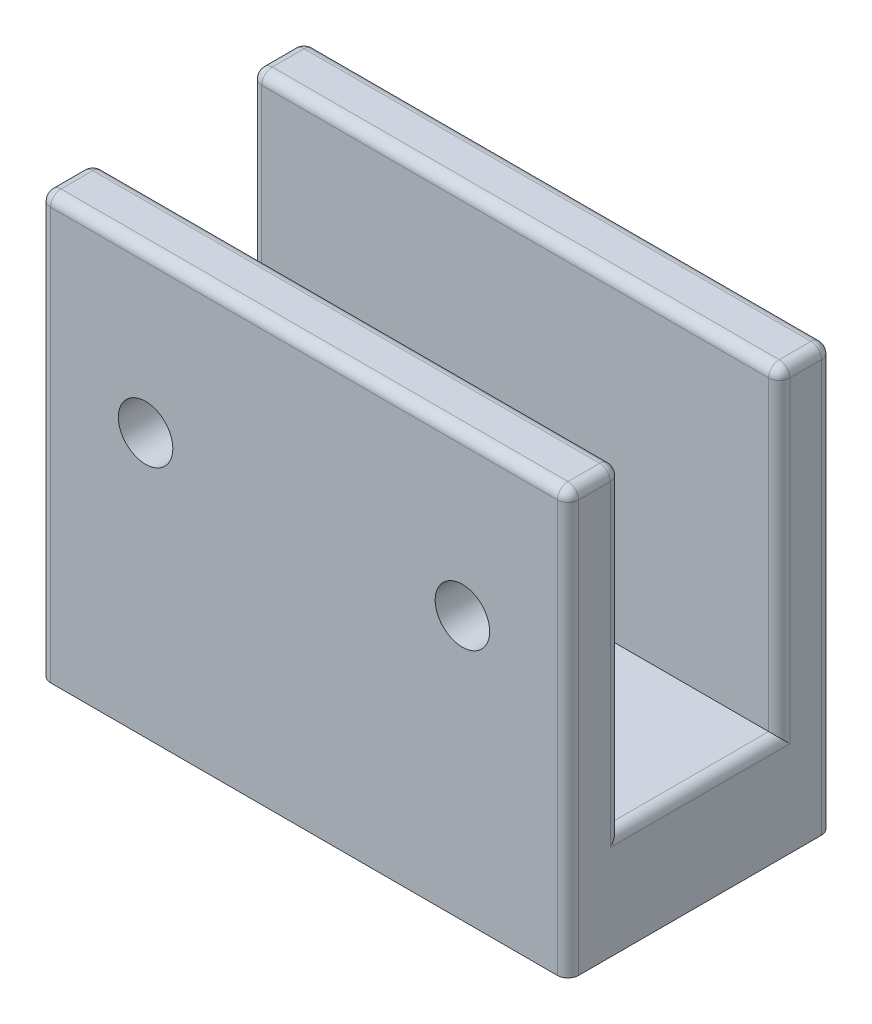
ISO-10303-21;
HEADER;
FILE_DESCRIPTION(('STEP AP214'),'2;1');
FILE_NAME('part.step','',(''),(''),'','','');
FILE_SCHEMA(('AUTOMOTIVE_DESIGN { 1 0 10303 214 1 1 1 1 }'));
ENDSEC;
DATA;
#1=APPLICATION_CONTEXT('core data for automotive mechanical design processes');
#2=APPLICATION_PROTOCOL_DEFINITION('international standard','automotive_design',2000,#1);
#3=PRODUCT_CONTEXT('',#1,'mechanical');
#4=PRODUCT('Part','Part','',(#3));
#5=PRODUCT_RELATED_PRODUCT_CATEGORY('part','',(#4));
#6=PRODUCT_DEFINITION_FORMATION('','',#4);
#7=PRODUCT_DEFINITION_CONTEXT('part definition',#1,'design');
#8=PRODUCT_DEFINITION('design','',#6,#7);
#9=PRODUCT_DEFINITION_SHAPE('','',#8);
#10=(LENGTH_UNIT() NAMED_UNIT(*) SI_UNIT(.MILLI.,.METRE.));
#11=(NAMED_UNIT(*) PLANE_ANGLE_UNIT() SI_UNIT($,.RADIAN.));
#12=(NAMED_UNIT(*) SI_UNIT($,.STERADIAN.) SOLID_ANGLE_UNIT());
#13=UNCERTAINTY_MEASURE_WITH_UNIT(LENGTH_MEASURE(1.E-05),#10,'distance_accuracy_value','');
#14=(GEOMETRIC_REPRESENTATION_CONTEXT(3) GLOBAL_UNCERTAINTY_ASSIGNED_CONTEXT((#13)) GLOBAL_UNIT_ASSIGNED_CONTEXT((#10,
#11,#12)) REPRESENTATION_CONTEXT('',''));
#15=CARTESIAN_POINT('',(0.,0.,0.));
#16=DIRECTION('',(0.,0.,1.));
#17=DIRECTION('',(1.,0.,0.));
#18=AXIS2_PLACEMENT_3D('',#15,#16,#17);
#19=CARTESIAN_POINT('',(0.,40.,0.));
#20=DIRECTION('',(0.,-1.,0.));
#21=DIRECTION('',(0.,0.,-1.));
#22=AXIS2_PLACEMENT_3D('',#19,#20,#21);
#23=PLANE('',#22);
#24=DIRECTION('',(1.,0.,0.));
#25=VECTOR('',#24,1.);
#26=CARTESIAN_POINT('',(0.,40.,8.5));
#27=LINE('',#26,#25);
#28=CARTESIAN_POINT('',(24.,40.,8.5));
#29=VERTEX_POINT('',#28);
#30=CARTESIAN_POINT('',(-24.,40.,8.5));
#31=VERTEX_POINT('',#30);
#32=EDGE_CURVE('E484',#29,#31,#27,.F.);
#33=ORIENTED_EDGE('',*,*,#32,.T.);
#34=DIRECTION('',(0.,0.,1.));
#35=VECTOR('',#34,1.);
#36=CARTESIAN_POINT('',(-24.,40.,0.));
#37=LINE('',#36,#35);
#38=CARTESIAN_POINT('',(-24.,40.,11.5));
#39=VERTEX_POINT('',#38);
#40=EDGE_CURVE('E348',#31,#39,#37,.T.);
#41=ORIENTED_EDGE('',*,*,#40,.T.);
#42=DIRECTION('',(1.,0.,0.));
#43=VECTOR('',#42,1.);
#44=CARTESIAN_POINT('',(0.,40.,11.5));
#45=LINE('',#44,#43);
#46=CARTESIAN_POINT('',(24.,40.,11.5));
#47=VERTEX_POINT('',#46);
#48=EDGE_CURVE('E353',#39,#47,#45,.T.);
#49=ORIENTED_EDGE('',*,*,#48,.T.);
#50=DIRECTION('',(0.,0.,-1.));
#51=VECTOR('',#50,1.);
#52=CARTESIAN_POINT('',(24.,40.,0.));
#53=LINE('',#52,#51);
#54=EDGE_CURVE('E508',#47,#29,#53,.T.);
#55=ORIENTED_EDGE('',*,*,#54,.T.);
#56=EDGE_LOOP('',(#33,#41,#49,#55));
#57=FACE_BOUND('',#56,.T.);
#58=ADVANCED_FACE('F33',(#57),#23,.F.);
#59=CARTESIAN_POINT('',(25.,40.,12.5));
#60=DIRECTION('',(-1.,0.,0.));
#61=DIRECTION('',(0.,0.,1.));
#62=AXIS2_PLACEMENT_3D('',#59,#60,#61);
#63=PLANE('',#62);
#64=DIRECTION('',(0.,0.,-1.));
#65=VECTOR('',#64,1.);
#66=CARTESIAN_POINT('',(25.,39.,12.5));
#67=LINE('',#66,#65);
#68=CARTESIAN_POINT('',(25.,39.,8.5));
#69=VERTEX_POINT('',#68);
#70=CARTESIAN_POINT('',(25.,39.,11.5));
#71=VERTEX_POINT('',#70);
#72=EDGE_CURVE('E42',#69,#71,#67,.F.);
#73=ORIENTED_EDGE('',*,*,#72,.T.);
#74=DIRECTION('',(0.,-1.,0.));
#75=VECTOR('',#74,1.);
#76=CARTESIAN_POINT('',(25.,40.,11.5));
#77=LINE('',#76,#75);
#78=CARTESIAN_POINT('',(25.,0.,11.5));
#79=VERTEX_POINT('',#78);
#80=EDGE_CURVE('E11',#71,#79,#77,.T.);
#81=ORIENTED_EDGE('',*,*,#80,.T.);
#82=DIRECTION('',(0.,0.,-1.));
#83=VECTOR('',#82,1.);
#84=CARTESIAN_POINT('',(25.,0.,12.5));
#85=LINE('',#84,#83);
#86=CARTESIAN_POINT('',(25.,0.,-11.5));
#87=VERTEX_POINT('',#86);
#88=EDGE_CURVE('E341',#79,#87,#85,.T.);
#89=ORIENTED_EDGE('',*,*,#88,.T.);
#90=DIRECTION('',(0.,-1.,0.));
#91=VECTOR('',#90,1.);
#92=CARTESIAN_POINT('',(25.,40.,-11.5));
#93=LINE('',#92,#91);
#94=CARTESIAN_POINT('',(25.,39.,-11.5));
#95=VERTEX_POINT('',#94);
#96=EDGE_CURVE('E232',#87,#95,#93,.F.);
#97=ORIENTED_EDGE('',*,*,#96,.T.);
#98=DIRECTION('',(0.,0.,-1.));
#99=VECTOR('',#98,1.);
#100=CARTESIAN_POINT('',(25.,39.,12.5));
#101=LINE('',#100,#99);
#102=CARTESIAN_POINT('',(25.,39.,-8.5));
#103=VERTEX_POINT('',#102);
#104=EDGE_CURVE('E230',#95,#103,#101,.F.);
#105=ORIENTED_EDGE('',*,*,#104,.T.);
#106=DIRECTION('',(0.,1.,0.));
#107=VECTOR('',#106,1.);
#108=CARTESIAN_POINT('',(25.,40.,-8.5));
#109=LINE('',#108,#107);
#110=CARTESIAN_POINT('',(25.,9.,-8.5));
#111=VERTEX_POINT('',#110);
#112=EDGE_CURVE('E227',#103,#111,#109,.F.);
#113=ORIENTED_EDGE('',*,*,#112,.T.);
#114=DIRECTION('',(0.,0.,-1.));
#115=VECTOR('',#114,1.);
#116=CARTESIAN_POINT('',(25.,9.,12.5));
#117=LINE('',#116,#115);
#118=CARTESIAN_POINT('',(25.,9.,8.5));
#119=VERTEX_POINT('',#118);
#120=EDGE_CURVE('E196',#111,#119,#117,.F.);
#121=ORIENTED_EDGE('',*,*,#120,.T.);
#122=DIRECTION('',(0.,1.,0.));
#123=VECTOR('',#122,1.);
#124=CARTESIAN_POINT('',(25.,40.,8.5));
#125=LINE('',#124,#123);
#126=EDGE_CURVE('E53',#119,#69,#125,.T.);
#127=ORIENTED_EDGE('',*,*,#126,.T.);
#128=EDGE_LOOP('',(#73,#81,#89,#97,#105,#113,#121,#127));
#129=FACE_BOUND('',#128,.T.);
#130=ADVANCED_FACE('F338',(#129),#63,.F.);
#131=CARTESIAN_POINT('',(-25.,40.,-12.5));
#132=DIRECTION('',(0.,0.,1.));
#133=DIRECTION('',(1.,0.,0.));
#134=AXIS2_PLACEMENT_3D('',#131,#132,#133);
#135=PLANE('',#134);
#136=DIRECTION('',(-1.,0.,0.));
#137=VECTOR('',#136,1.);
#138=CARTESIAN_POINT('',(-25.,0.,-12.5));
#139=LINE('',#138,#137);
#140=CARTESIAN_POINT('',(24.,0.,-12.5));
#141=VERTEX_POINT('',#140);
#142=CARTESIAN_POINT('',(-24.,0.,-12.5));
#143=VERTEX_POINT('',#142);
#144=EDGE_CURVE('E368',#141,#143,#139,.T.);
#145=ORIENTED_EDGE('',*,*,#144,.T.);
#146=DIRECTION('',(0.,-1.,0.));
#147=VECTOR('',#146,1.);
#148=CARTESIAN_POINT('',(-24.,40.,-12.5));
#149=LINE('',#148,#147);
#150=CARTESIAN_POINT('',(-24.,39.,-12.5));
#151=VERTEX_POINT('',#150);
#152=EDGE_CURVE('E362',#143,#151,#149,.F.);
#153=ORIENTED_EDGE('',*,*,#152,.T.);
#154=DIRECTION('',(-1.,0.,0.));
#155=VECTOR('',#154,1.);
#156=CARTESIAN_POINT('',(-25.,39.,-12.5));
#157=LINE('',#156,#155);
#158=CARTESIAN_POINT('',(24.,39.,-12.5));
#159=VERTEX_POINT('',#158);
#160=EDGE_CURVE('E323',#151,#159,#157,.F.);
#161=ORIENTED_EDGE('',*,*,#160,.T.);
#162=DIRECTION('',(0.,-1.,0.));
#163=VECTOR('',#162,1.);
#164=CARTESIAN_POINT('',(24.,40.,-12.5));
#165=LINE('',#164,#163);
#166=EDGE_CURVE('E344',#159,#141,#165,.T.);
#167=ORIENTED_EDGE('',*,*,#166,.T.);
#168=EDGE_LOOP('',(#145,#153,#161,#167));
#169=FACE_BOUND('',#168,.T.);
#170=ADVANCED_FACE('F367',(#169),#135,.F.);
#171=CARTESIAN_POINT('',(-25.,40.,12.5));
#172=DIRECTION('',(1.,0.,0.));
#173=DIRECTION('',(0.,0.,-1.));
#174=AXIS2_PLACEMENT_3D('',#171,#172,#173);
#175=PLANE('',#174);
#176=DIRECTION('',(0.,0.,1.));
#177=VECTOR('',#176,1.);
#178=CARTESIAN_POINT('',(-25.,39.,12.5));
#179=LINE('',#178,#177);
#180=CARTESIAN_POINT('',(-25.,39.,-8.5));
#181=VERTEX_POINT('',#180);
#182=CARTESIAN_POINT('',(-25.,39.,-11.5));
#183=VERTEX_POINT('',#182);
#184=EDGE_CURVE('E380',#181,#183,#179,.F.);
#185=ORIENTED_EDGE('',*,*,#184,.T.);
#186=DIRECTION('',(0.,-1.,0.));
#187=VECTOR('',#186,1.);
#188=CARTESIAN_POINT('',(-25.,40.,-11.5));
#189=LINE('',#188,#187);
#190=CARTESIAN_POINT('',(-25.,0.,-11.5));
#191=VERTEX_POINT('',#190);
#192=EDGE_CURVE('E373',#183,#191,#189,.T.);
#193=ORIENTED_EDGE('',*,*,#192,.T.);
#194=DIRECTION('',(0.,0.,1.));
#195=VECTOR('',#194,1.);
#196=CARTESIAN_POINT('',(-25.,0.,12.5));
#197=LINE('',#196,#195);
#198=CARTESIAN_POINT('',(-25.,0.,11.5));
#199=VERTEX_POINT('',#198);
#200=EDGE_CURVE('E524',#191,#199,#197,.T.);
#201=ORIENTED_EDGE('',*,*,#200,.T.);
#202=DIRECTION('',(0.,-1.,0.));
#203=VECTOR('',#202,1.);
#204=CARTESIAN_POINT('',(-25.,40.,11.5));
#205=LINE('',#204,#203);
#206=CARTESIAN_POINT('',(-25.,39.,11.5));
#207=VERTEX_POINT('',#206);
#208=EDGE_CURVE('E477',#199,#207,#205,.F.);
#209=ORIENTED_EDGE('',*,*,#208,.T.);
#210=DIRECTION('',(0.,0.,1.));
#211=VECTOR('',#210,1.);
#212=CARTESIAN_POINT('',(-25.,39.,12.5));
#213=LINE('',#212,#211);
#214=CARTESIAN_POINT('',(-25.,39.,8.5));
#215=VERTEX_POINT('',#214);
#216=EDGE_CURVE('E498',#207,#215,#213,.F.);
#217=ORIENTED_EDGE('',*,*,#216,.T.);
#218=DIRECTION('',(0.,1.,0.));
#219=VECTOR('',#218,1.);
#220=CARTESIAN_POINT('',(-25.,40.,8.5));
#221=LINE('',#220,#219);
#222=CARTESIAN_POINT('',(-25.,9.,8.5));
#223=VERTEX_POINT('',#222);
#224=EDGE_CURVE('E494',#215,#223,#221,.F.);
#225=ORIENTED_EDGE('',*,*,#224,.T.);
#226=DIRECTION('',(0.,0.,1.));
#227=VECTOR('',#226,1.);
#228=CARTESIAN_POINT('',(-25.,9.,12.5));
#229=LINE('',#228,#227);
#230=CARTESIAN_POINT('',(-25.,9.,-8.5));
#231=VERTEX_POINT('',#230);
#232=EDGE_CURVE('E497',#223,#231,#229,.F.);
#233=ORIENTED_EDGE('',*,*,#232,.T.);
#234=DIRECTION('',(0.,1.,0.));
#235=VECTOR('',#234,1.);
#236=CARTESIAN_POINT('',(-25.,40.,-8.5));
#237=LINE('',#236,#235);
#238=EDGE_CURVE('E500',#231,#181,#237,.T.);
#239=ORIENTED_EDGE('',*,*,#238,.T.);
#240=EDGE_LOOP('',(#185,#193,#201,#209,#217,#225,#233,#239));
#241=FACE_BOUND('',#240,.T.);
#242=ADVANCED_FACE('F419',(#241),#175,.F.);
#243=CARTESIAN_POINT('',(-25.,40.,12.5));
#244=DIRECTION('',(0.,0.,-1.));
#245=DIRECTION('',(-1.,0.,0.));
#246=AXIS2_PLACEMENT_3D('',#243,#244,#245);
#247=PLANE('',#246);
#248=CARTESIAN_POINT('',(15.,25.,12.5));
#249=DIRECTION('',(0.,0.,1.));
#250=DIRECTION('',(1.,0.,0.));
#251=AXIS2_PLACEMENT_3D('',#248,#249,#250);
#252=CIRCLE('',#251,2.579687);
#253=CARTESIAN_POINT('',(17.579687,25.,12.5));
#254=VERTEX_POINT('',#253);
#255=EDGE_CURVE('E538',#254,#254,#252,.T.);
#256=ORIENTED_EDGE('',*,*,#255,.F.);
#257=EDGE_LOOP('',(#256));
#258=FACE_BOUND('',#257,.T.);
#259=CARTESIAN_POINT('',(-15.,25.,12.5));
#260=DIRECTION('',(0.,0.,1.));
#261=DIRECTION('',(1.,0.,0.));
#262=AXIS2_PLACEMENT_3D('',#259,#260,#261);
#263=CIRCLE('',#262,2.5796875);
#264=CARTESIAN_POINT('',(-12.4203125,25.,12.5));
#265=VERTEX_POINT('',#264);
#266=EDGE_CURVE('E532',#265,#265,#263,.T.);
#267=ORIENTED_EDGE('',*,*,#266,.F.);
#268=EDGE_LOOP('',(#267));
#269=FACE_BOUND('',#268,.T.);
#270=DIRECTION('',(1.,0.,0.));
#271=VECTOR('',#270,1.);
#272=CARTESIAN_POINT('',(-25.,39.,12.5));
#273=LINE('',#272,#271);
#274=CARTESIAN_POINT('',(24.,39.,12.5));
#275=VERTEX_POINT('',#274);
#276=CARTESIAN_POINT('',(-24.,39.,12.5));
#277=VERTEX_POINT('',#276);
#278=EDGE_CURVE('E223',#275,#277,#273,.F.);
#279=ORIENTED_EDGE('',*,*,#278,.T.);
#280=DIRECTION('',(0.,-1.,0.));
#281=VECTOR('',#280,1.);
#282=CARTESIAN_POINT('',(-24.,40.,12.5));
#283=LINE('',#282,#281);
#284=CARTESIAN_POINT('',(-24.,0.,12.5));
#285=VERTEX_POINT('',#284);
#286=EDGE_CURVE('E225',#277,#285,#283,.T.);
#287=ORIENTED_EDGE('',*,*,#286,.T.);
#288=DIRECTION('',(1.,0.,0.));
#289=VECTOR('',#288,1.);
#290=CARTESIAN_POINT('',(-25.,0.,12.5));
#291=LINE('',#290,#289);
#292=CARTESIAN_POINT('',(24.,0.,12.5));
#293=VERTEX_POINT('',#292);
#294=EDGE_CURVE('E182',#285,#293,#291,.T.);
#295=ORIENTED_EDGE('',*,*,#294,.T.);
#296=DIRECTION('',(0.,-1.,0.));
#297=VECTOR('',#296,1.);
#298=CARTESIAN_POINT('',(24.,40.,12.5));
#299=LINE('',#298,#297);
#300=EDGE_CURVE('E221',#293,#275,#299,.F.);
#301=ORIENTED_EDGE('',*,*,#300,.T.);
#302=EDGE_LOOP('',(#279,#287,#295,#301));
#303=FACE_BOUND('',#302,.T.);
#304=ADVANCED_FACE('F412',(#258,#269,#303),#247,.F.);
#305=DIRECTION('',(0.,0.,-1.));
#306=VECTOR('',#305,1.);
#307=CARTESIAN_POINT('',(24.,40.,0.));
#308=LINE('',#307,#306);
#309=CARTESIAN_POINT('',(24.,40.,-8.5));
#310=VERTEX_POINT('',#309);
#311=CARTESIAN_POINT('',(24.,40.,-11.5));
#312=VERTEX_POINT('',#311);
#313=EDGE_CURVE('E331',#310,#312,#308,.T.);
#314=ORIENTED_EDGE('',*,*,#313,.T.);
#315=DIRECTION('',(-1.,0.,0.));
#316=VECTOR('',#315,1.);
#317=CARTESIAN_POINT('',(0.,40.,-11.5));
#318=LINE('',#317,#316);
#319=CARTESIAN_POINT('',(-24.,40.,-11.5));
#320=VERTEX_POINT('',#319);
#321=EDGE_CURVE('E207',#312,#320,#318,.T.);
#322=ORIENTED_EDGE('',*,*,#321,.T.);
#323=DIRECTION('',(0.,0.,1.));
#324=VECTOR('',#323,1.);
#325=CARTESIAN_POINT('',(-24.,40.,0.));
#326=LINE('',#325,#324);
#327=CARTESIAN_POINT('',(-24.,40.,-8.5));
#328=VERTEX_POINT('',#327);
#329=EDGE_CURVE('E210',#320,#328,#326,.T.);
#330=ORIENTED_EDGE('',*,*,#329,.T.);
#331=DIRECTION('',(-1.,0.,0.));
#332=VECTOR('',#331,1.);
#333=CARTESIAN_POINT('',(0.,40.,-8.5));
#334=LINE('',#333,#332);
#335=EDGE_CURVE('E333',#328,#310,#334,.F.);
#336=ORIENTED_EDGE('',*,*,#335,.T.);
#337=EDGE_LOOP('',(#314,#322,#330,#336));
#338=FACE_BOUND('',#337,.T.);
#339=ADVANCED_FACE('F328',(#338),#23,.F.);
#340=CARTESIAN_POINT('',(0.,0.,0.));
#341=DIRECTION('',(0.,-1.,0.));
#342=DIRECTION('',(0.,0.,-1.));
#343=AXIS2_PLACEMENT_3D('',#340,#341,#342);
#344=PLANE('',#343);
#345=CARTESIAN_POINT('',(0.,0.,0.));
#346=DIRECTION('',(0.,-1.,0.));
#347=DIRECTION('',(0.,0.,-1.));
#348=AXIS2_PLACEMENT_3D('',#345,#346,#347);
#349=CIRCLE('',#348,2.57968);
#350=CARTESIAN_POINT('',(0.,0.,-2.57968));
#351=VERTEX_POINT('',#350);
#352=EDGE_CURVE('E542',#351,#351,#349,.T.);
#353=ORIENTED_EDGE('',*,*,#352,.F.);
#354=EDGE_LOOP('',(#353));
#355=FACE_BOUND('',#354,.T.);
#356=ORIENTED_EDGE('',*,*,#200,.F.);
#357=CARTESIAN_POINT('',(-24.,0.,-11.5));
#358=DIRECTION('',(0.,-1.,0.));
#359=DIRECTION('',(0.,0.,-1.));
#360=AXIS2_PLACEMENT_3D('',#357,#358,#359);
#361=CIRCLE('',#360,1.);
#362=EDGE_CURVE('E358',#191,#143,#361,.T.);
#363=ORIENTED_EDGE('',*,*,#362,.T.);
#364=ORIENTED_EDGE('',*,*,#144,.F.);
#365=CARTESIAN_POINT('',(24.,0.,-11.5));
#366=DIRECTION('',(0.,-1.,0.));
#367=DIRECTION('',(0.,0.,-1.));
#368=AXIS2_PLACEMENT_3D('',#365,#366,#367);
#369=CIRCLE('',#368,1.);
#370=EDGE_CURVE('E343',#141,#87,#369,.T.);
#371=ORIENTED_EDGE('',*,*,#370,.T.);
#372=ORIENTED_EDGE('',*,*,#88,.F.);
#373=CARTESIAN_POINT('',(24.,0.,11.5));
#374=DIRECTION('',(0.,-1.,0.));
#375=DIRECTION('',(0.,0.,-1.));
#376=AXIS2_PLACEMENT_3D('',#373,#374,#375);
#377=CIRCLE('',#376,1.);
#378=EDGE_CURVE('E347',#79,#293,#377,.T.);
#379=ORIENTED_EDGE('',*,*,#378,.T.);
#380=ORIENTED_EDGE('',*,*,#294,.F.);
#381=CARTESIAN_POINT('',(-24.,0.,11.5));
#382=DIRECTION('',(0.,-1.,0.));
#383=DIRECTION('',(0.,0.,-1.));
#384=AXIS2_PLACEMENT_3D('',#381,#382,#383);
#385=CIRCLE('',#384,1.);
#386=EDGE_CURVE('E350',#285,#199,#385,.T.);
#387=ORIENTED_EDGE('',*,*,#386,.T.);
#388=EDGE_LOOP('',(#356,#363,#364,#371,#372,#379,#380,#387));
#389=FACE_BOUND('',#388,.T.);
#390=ADVANCED_FACE('F411',(#355,#389),#344,.T.);
#391=CARTESIAN_POINT('',(-25.,10.,7.5));
#392=DIRECTION('',(0.,0.,1.));
#393=DIRECTION('',(1.,0.,0.));
#394=AXIS2_PLACEMENT_3D('',#391,#392,#393);
#395=PLANE('',#394);
#396=CARTESIAN_POINT('',(15.,25.,7.5));
#397=DIRECTION('',(0.,0.,1.));
#398=DIRECTION('',(1.,0.,0.));
#399=AXIS2_PLACEMENT_3D('',#396,#397,#398);
#400=CIRCLE('',#399,2.579687);
#401=CARTESIAN_POINT('',(17.579687,25.,7.5));
#402=VERTEX_POINT('',#401);
#403=EDGE_CURVE('E535',#402,#402,#400,.F.);
#404=ORIENTED_EDGE('',*,*,#403,.F.);
#405=EDGE_LOOP('',(#404));
#406=FACE_BOUND('',#405,.T.);
#407=CARTESIAN_POINT('',(-15.,25.,7.5));
#408=DIRECTION('',(0.,0.,1.));
#409=DIRECTION('',(1.,0.,0.));
#410=AXIS2_PLACEMENT_3D('',#407,#408,#409);
#411=CIRCLE('',#410,2.5796875);
#412=CARTESIAN_POINT('',(-12.4203125,25.,7.5));
#413=VERTEX_POINT('',#412);
#414=EDGE_CURVE('E239',#413,#413,#411,.F.);
#415=ORIENTED_EDGE('',*,*,#414,.F.);
#416=EDGE_LOOP('',(#415));
#417=FACE_BOUND('',#416,.T.);
#418=DIRECTION('',(1.,0.,0.));
#419=VECTOR('',#418,1.);
#420=CARTESIAN_POINT('',(-25.,10.,7.5));
#421=LINE('',#420,#419);
#422=CARTESIAN_POINT('',(-24.,10.,7.5));
#423=VERTEX_POINT('',#422);
#424=CARTESIAN_POINT('',(24.,10.,7.5));
#425=VERTEX_POINT('',#424);
#426=EDGE_CURVE('E176',#423,#425,#421,.T.);
#427=ORIENTED_EDGE('',*,*,#426,.F.);
#428=DIRECTION('',(0.,1.,0.));
#429=VECTOR('',#428,1.);
#430=CARTESIAN_POINT('',(-24.,10.,7.5));
#431=LINE('',#430,#429);
#432=CARTESIAN_POINT('',(-24.,39.,7.5));
#433=VERTEX_POINT('',#432);
#434=EDGE_CURVE('E219',#423,#433,#431,.T.);
#435=ORIENTED_EDGE('',*,*,#434,.T.);
#436=DIRECTION('',(1.,0.,0.));
#437=VECTOR('',#436,1.);
#438=CARTESIAN_POINT('',(-25.,39.,7.5));
#439=LINE('',#438,#437);
#440=CARTESIAN_POINT('',(24.,39.,7.5));
#441=VERTEX_POINT('',#440);
#442=EDGE_CURVE('E217',#433,#441,#439,.T.);
#443=ORIENTED_EDGE('',*,*,#442,.T.);
#444=DIRECTION('',(0.,1.,0.));
#445=VECTOR('',#444,1.);
#446=CARTESIAN_POINT('',(24.,10.,7.5));
#447=LINE('',#446,#445);
#448=EDGE_CURVE('E215',#441,#425,#447,.F.);
#449=ORIENTED_EDGE('',*,*,#448,.T.);
#450=EDGE_LOOP('',(#427,#435,#443,#449));
#451=FACE_BOUND('',#450,.T.);
#452=ADVANCED_FACE('F417',(#406,#417,#451),#395,.F.);
#453=CARTESIAN_POINT('',(-25.,10.,-7.5));
#454=DIRECTION('',(0.,0.,-1.));
#455=DIRECTION('',(-1.,0.,0.));
#456=AXIS2_PLACEMENT_3D('',#453,#454,#455);
#457=PLANE('',#456);
#458=DIRECTION('',(-1.,0.,0.));
#459=VECTOR('',#458,1.);
#460=CARTESIAN_POINT('',(-25.,39.,-7.5));
#461=LINE('',#460,#459);
#462=CARTESIAN_POINT('',(24.,39.,-7.5));
#463=VERTEX_POINT('',#462);
#464=CARTESIAN_POINT('',(-24.,39.,-7.5));
#465=VERTEX_POINT('',#464);
#466=EDGE_CURVE('E206',#463,#465,#461,.T.);
#467=ORIENTED_EDGE('',*,*,#466,.T.);
#468=DIRECTION('',(0.,1.,0.));
#469=VECTOR('',#468,1.);
#470=CARTESIAN_POINT('',(-24.,10.,-7.5));
#471=LINE('',#470,#469);
#472=CARTESIAN_POINT('',(-24.,10.,-7.5));
#473=VERTEX_POINT('',#472);
#474=EDGE_CURVE('E190',#465,#473,#471,.F.);
#475=ORIENTED_EDGE('',*,*,#474,.T.);
#476=DIRECTION('',(-1.,0.,0.));
#477=VECTOR('',#476,1.);
#478=CARTESIAN_POINT('',(-25.,10.,-7.5));
#479=LINE('',#478,#477);
#480=CARTESIAN_POINT('',(24.,10.,-7.5));
#481=VERTEX_POINT('',#480);
#482=EDGE_CURVE('E173',#481,#473,#479,.T.);
#483=ORIENTED_EDGE('',*,*,#482,.F.);
#484=DIRECTION('',(0.,1.,0.));
#485=VECTOR('',#484,1.);
#486=CARTESIAN_POINT('',(24.,10.,-7.5));
#487=LINE('',#486,#485);
#488=EDGE_CURVE('E187',#481,#463,#487,.T.);
#489=ORIENTED_EDGE('',*,*,#488,.T.);
#490=EDGE_LOOP('',(#467,#475,#483,#489));
#491=FACE_BOUND('',#490,.T.);
#492=ADVANCED_FACE('F185',(#491),#457,.F.);
#493=CARTESIAN_POINT('',(0.,10.,0.));
#494=DIRECTION('',(0.,-1.,0.));
#495=DIRECTION('',(0.,0.,-1.));
#496=AXIS2_PLACEMENT_3D('',#493,#494,#495);
#497=PLANE('',#496);
#498=ORIENTED_EDGE('',*,*,#482,.T.);
#499=DIRECTION('',(0.,0.,1.));
#500=VECTOR('',#499,1.);
#501=CARTESIAN_POINT('',(-24.,10.,0.));
#502=LINE('',#501,#500);
#503=EDGE_CURVE('E181',#473,#423,#502,.T.);
#504=ORIENTED_EDGE('',*,*,#503,.T.);
#505=ORIENTED_EDGE('',*,*,#426,.T.);
#506=DIRECTION('',(0.,0.,-1.));
#507=VECTOR('',#506,1.);
#508=CARTESIAN_POINT('',(24.,10.,0.));
#509=LINE('',#508,#507);
#510=EDGE_CURVE('E169',#425,#481,#509,.T.);
#511=ORIENTED_EDGE('',*,*,#510,.T.);
#512=EDGE_LOOP('',(#498,#504,#505,#511));
#513=FACE_BOUND('',#512,.T.);
#514=ADVANCED_FACE('F171',(#513),#497,.F.);
#515=CARTESIAN_POINT('',(24.,40.,-11.5));
#516=DIRECTION('',(0.,-1.,0.));
#517=DIRECTION('',(0.,0.,-1.));
#518=AXIS2_PLACEMENT_3D('',#515,#516,#517);
#519=CYLINDRICAL_SURFACE('',#518,1.);
#520=ORIENTED_EDGE('',*,*,#370,.F.);
#521=ORIENTED_EDGE('',*,*,#166,.F.);
#522=CARTESIAN_POINT('',(24.,39.,-11.5));
#523=DIRECTION('',(0.,1.,0.));
#524=DIRECTION('',(0.,0.,1.));
#525=AXIS2_PLACEMENT_3D('',#522,#523,#524);
#526=CIRCLE('',#525,1.);
#527=EDGE_CURVE('E37',#95,#159,#526,.T.);
#528=ORIENTED_EDGE('',*,*,#527,.F.);
#529=ORIENTED_EDGE('',*,*,#96,.F.);
#530=EDGE_LOOP('',(#520,#521,#528,#529));
#531=FACE_BOUND('',#530,.T.);
#532=ADVANCED_FACE('F35',(#531),#519,.T.);
#533=CARTESIAN_POINT('',(24.,40.,11.5));
#534=DIRECTION('',(0.,-1.,0.));
#535=DIRECTION('',(0.,0.,-1.));
#536=AXIS2_PLACEMENT_3D('',#533,#534,#535);
#537=CYLINDRICAL_SURFACE('',#536,1.);
#538=ORIENTED_EDGE('',*,*,#378,.F.);
#539=ORIENTED_EDGE('',*,*,#80,.F.);
#540=CARTESIAN_POINT('',(24.,39.,11.5));
#541=DIRECTION('',(0.,1.,0.));
#542=DIRECTION('',(0.,0.,1.));
#543=AXIS2_PLACEMENT_3D('',#540,#541,#542);
#544=CIRCLE('',#543,1.);
#545=EDGE_CURVE('E302',#275,#71,#544,.T.);
#546=ORIENTED_EDGE('',*,*,#545,.F.);
#547=ORIENTED_EDGE('',*,*,#300,.F.);
#548=EDGE_LOOP('',(#538,#539,#546,#547));
#549=FACE_BOUND('',#548,.T.);
#550=ADVANCED_FACE('F561',(#549),#537,.T.);
#551=CARTESIAN_POINT('',(24.,39.,-11.5));
#552=DIRECTION('',(0.,0.,1.));
#553=DIRECTION('',(1.,0.,0.));
#554=AXIS2_PLACEMENT_3D('',#551,#552,#553);
#555=SPHERICAL_SURFACE('',#554,1.);
#556=CARTESIAN_POINT('',(24.,39.,-11.5));
#557=DIRECTION('',(0.,0.,-1.));
#558=DIRECTION('',(-1.,0.,0.));
#559=AXIS2_PLACEMENT_3D('',#556,#557,#558);
#560=CIRCLE('',#559,1.);
#561=EDGE_CURVE('E199',#95,#312,#560,.F.);
#562=ORIENTED_EDGE('',*,*,#561,.F.);
#563=ORIENTED_EDGE('',*,*,#527,.T.);
#564=CARTESIAN_POINT('',(24.,39.,-11.5));
#565=DIRECTION('',(1.,0.,0.));
#566=DIRECTION('',(0.,0.,-1.));
#567=AXIS2_PLACEMENT_3D('',#564,#565,#566);
#568=CIRCLE('',#567,1.);
#569=EDGE_CURVE('E300',#312,#159,#568,.F.);
#570=ORIENTED_EDGE('',*,*,#569,.F.);
#571=EDGE_LOOP('',(#562,#563,#570));
#572=FACE_BOUND('',#571,.T.);
#573=ADVANCED_FACE('F313',(#572),#555,.T.);
#574=CARTESIAN_POINT('',(24.,9.,0.));
#575=DIRECTION('',(0.,0.,-1.));
#576=DIRECTION('',(-1.,0.,0.));
#577=AXIS2_PLACEMENT_3D('',#574,#575,#576);
#578=CYLINDRICAL_SURFACE('',#577,1.);
#579=CARTESIAN_POINT('',(24.,9.,8.5));
#580=DIRECTION('',(0.,-0.707106781186547,-0.707106781186547));
#581=DIRECTION('',(0.,0.707106781186547,-0.707106781186547));
#582=AXIS2_PLACEMENT_3D('',#579,#580,#581);
#583=ELLIPSE('',#582,1.41421356237309,1.);
#584=EDGE_CURVE('E200',#119,#425,#583,.F.);
#585=ORIENTED_EDGE('',*,*,#584,.F.);
#586=ORIENTED_EDGE('',*,*,#120,.F.);
#587=CARTESIAN_POINT('',(24.,9.,-8.5));
#588=DIRECTION('',(0.,0.707106781186547,-0.707106781186547));
#589=DIRECTION('',(0.,-0.707106781186547,-0.707106781186547));
#590=AXIS2_PLACEMENT_3D('',#587,#588,#589);
#591=ELLIPSE('',#590,1.41421356237309,1.);
#592=EDGE_CURVE('E194',#481,#111,#591,.T.);
#593=ORIENTED_EDGE('',*,*,#592,.F.);
#594=ORIENTED_EDGE('',*,*,#510,.F.);
#595=EDGE_LOOP('',(#585,#586,#593,#594));
#596=FACE_BOUND('',#595,.T.);
#597=ADVANCED_FACE('F195',(#596),#578,.T.);
#598=CARTESIAN_POINT('',(24.,39.,11.5));
#599=DIRECTION('',(0.,0.,1.));
#600=DIRECTION('',(1.,0.,0.));
#601=AXIS2_PLACEMENT_3D('',#598,#599,#600);
#602=SPHERICAL_SURFACE('',#601,1.);
#603=CARTESIAN_POINT('',(24.,39.,11.5));
#604=DIRECTION('',(1.,0.,0.));
#605=DIRECTION('',(0.,0.,-1.));
#606=AXIS2_PLACEMENT_3D('',#603,#604,#605);
#607=CIRCLE('',#606,1.);
#608=EDGE_CURVE('E291',#275,#47,#607,.F.);
#609=ORIENTED_EDGE('',*,*,#608,.F.);
#610=ORIENTED_EDGE('',*,*,#545,.T.);
#611=CARTESIAN_POINT('',(24.,39.,11.5));
#612=DIRECTION('',(0.,0.,1.));
#613=DIRECTION('',(1.,0.,0.));
#614=AXIS2_PLACEMENT_3D('',#611,#612,#613);
#615=CIRCLE('',#614,1.);
#616=EDGE_CURVE('E294',#47,#71,#615,.F.);
#617=ORIENTED_EDGE('',*,*,#616,.F.);
#618=EDGE_LOOP('',(#609,#610,#617));
#619=FACE_BOUND('',#618,.T.);
#620=ADVANCED_FACE('F562',(#619),#602,.T.);
#621=CARTESIAN_POINT('',(-24.,40.,-11.5));
#622=DIRECTION('',(0.,-1.,0.));
#623=DIRECTION('',(0.,0.,-1.));
#624=AXIS2_PLACEMENT_3D('',#621,#622,#623);
#625=CYLINDRICAL_SURFACE('',#624,1.);
#626=ORIENTED_EDGE('',*,*,#362,.F.);
#627=ORIENTED_EDGE('',*,*,#192,.F.);
#628=CARTESIAN_POINT('',(-24.,39.,-11.5));
#629=DIRECTION('',(0.,1.,0.));
#630=DIRECTION('',(0.,0.,1.));
#631=AXIS2_PLACEMENT_3D('',#628,#629,#630);
#632=CIRCLE('',#631,1.);
#633=EDGE_CURVE('E288',#151,#183,#632,.T.);
#634=ORIENTED_EDGE('',*,*,#633,.F.);
#635=ORIENTED_EDGE('',*,*,#152,.F.);
#636=EDGE_LOOP('',(#626,#627,#634,#635));
#637=FACE_BOUND('',#636,.T.);
#638=ADVANCED_FACE('F371',(#637),#625,.T.);
#639=CARTESIAN_POINT('',(0.,39.,-11.5));
#640=DIRECTION('',(-1.,0.,0.));
#641=DIRECTION('',(0.,0.,1.));
#642=AXIS2_PLACEMENT_3D('',#639,#640,#641);
#643=CYLINDRICAL_SURFACE('',#642,1.);
#644=ORIENTED_EDGE('',*,*,#569,.T.);
#645=ORIENTED_EDGE('',*,*,#160,.F.);
#646=CARTESIAN_POINT('',(-24.,39.,-11.5));
#647=DIRECTION('',(-1.,0.,0.));
#648=DIRECTION('',(0.,0.,1.));
#649=AXIS2_PLACEMENT_3D('',#646,#647,#648);
#650=CIRCLE('',#649,1.);
#651=EDGE_CURVE('E285',#320,#151,#650,.T.);
#652=ORIENTED_EDGE('',*,*,#651,.F.);
#653=ORIENTED_EDGE('',*,*,#321,.F.);
#654=EDGE_LOOP('',(#644,#645,#652,#653));
#655=FACE_BOUND('',#654,.T.);
#656=ADVANCED_FACE('F321',(#655),#643,.T.);
#657=CARTESIAN_POINT('',(24.,39.,0.));
#658=DIRECTION('',(0.,0.,-1.));
#659=DIRECTION('',(-1.,0.,0.));
#660=AXIS2_PLACEMENT_3D('',#657,#658,#659);
#661=CYLINDRICAL_SURFACE('',#660,1.);
#662=ORIENTED_EDGE('',*,*,#561,.T.);
#663=ORIENTED_EDGE('',*,*,#313,.F.);
#664=CARTESIAN_POINT('',(24.,39.,-8.5));
#665=DIRECTION('',(0.,0.,1.));
#666=DIRECTION('',(1.,0.,0.));
#667=AXIS2_PLACEMENT_3D('',#664,#665,#666);
#668=CIRCLE('',#667,1.);
#669=EDGE_CURVE('E282',#103,#310,#668,.T.);
#670=ORIENTED_EDGE('',*,*,#669,.F.);
#671=ORIENTED_EDGE('',*,*,#104,.F.);
#672=EDGE_LOOP('',(#662,#663,#670,#671));
#673=FACE_BOUND('',#672,.T.);
#674=ADVANCED_FACE('F337',(#673),#661,.T.);
#675=CARTESIAN_POINT('',(24.,10.,-8.5));
#676=DIRECTION('',(0.,1.,0.));
#677=DIRECTION('',(0.,0.,1.));
#678=AXIS2_PLACEMENT_3D('',#675,#676,#677);
#679=CYLINDRICAL_SURFACE('',#678,1.);
#680=ORIENTED_EDGE('',*,*,#592,.T.);
#681=ORIENTED_EDGE('',*,*,#112,.F.);
#682=CARTESIAN_POINT('',(24.,39.,-8.5));
#683=DIRECTION('',(0.,1.,0.));
#684=DIRECTION('',(0.,0.,1.));
#685=AXIS2_PLACEMENT_3D('',#682,#683,#684);
#686=CIRCLE('',#685,1.);
#687=EDGE_CURVE('E204',#463,#103,#686,.T.);
#688=ORIENTED_EDGE('',*,*,#687,.F.);
#689=ORIENTED_EDGE('',*,*,#488,.F.);
#690=EDGE_LOOP('',(#680,#681,#688,#689));
#691=FACE_BOUND('',#690,.T.);
#692=ADVANCED_FACE('F202',(#691),#679,.T.);
#693=CARTESIAN_POINT('',(24.,40.,8.5));
#694=DIRECTION('',(0.,1.,0.));
#695=DIRECTION('',(0.,0.,1.));
#696=AXIS2_PLACEMENT_3D('',#693,#694,#695);
#697=CYLINDRICAL_SURFACE('',#696,1.);
#698=ORIENTED_EDGE('',*,*,#584,.T.);
#699=ORIENTED_EDGE('',*,*,#448,.F.);
#700=CARTESIAN_POINT('',(24.,39.,8.5));
#701=DIRECTION('',(0.,1.,0.));
#702=DIRECTION('',(0.,0.,1.));
#703=AXIS2_PLACEMENT_3D('',#700,#701,#702);
#704=CIRCLE('',#703,1.);
#705=EDGE_CURVE('E278',#69,#441,#704,.T.);
#706=ORIENTED_EDGE('',*,*,#705,.F.);
#707=ORIENTED_EDGE('',*,*,#126,.F.);
#708=EDGE_LOOP('',(#698,#699,#706,#707));
#709=FACE_BOUND('',#708,.T.);
#710=ADVANCED_FACE('F518',(#709),#697,.T.);
#711=CARTESIAN_POINT('',(24.,39.,0.));
#712=DIRECTION('',(0.,0.,-1.));
#713=DIRECTION('',(-1.,0.,0.));
#714=AXIS2_PLACEMENT_3D('',#711,#712,#713);
#715=CYLINDRICAL_SURFACE('',#714,1.);
#716=ORIENTED_EDGE('',*,*,#616,.T.);
#717=ORIENTED_EDGE('',*,*,#72,.F.);
#718=CARTESIAN_POINT('',(24.,39.,8.5));
#719=DIRECTION('',(0.,0.,-1.));
#720=DIRECTION('',(-1.,0.,0.));
#721=AXIS2_PLACEMENT_3D('',#718,#719,#720);
#722=CIRCLE('',#721,1.);
#723=EDGE_CURVE('E275',#29,#69,#722,.T.);
#724=ORIENTED_EDGE('',*,*,#723,.F.);
#725=ORIENTED_EDGE('',*,*,#54,.F.);
#726=EDGE_LOOP('',(#716,#717,#724,#725));
#727=FACE_BOUND('',#726,.T.);
#728=ADVANCED_FACE('F514',(#727),#715,.T.);
#729=CARTESIAN_POINT('',(0.,39.,11.5));
#730=DIRECTION('',(1.,0.,0.));
#731=DIRECTION('',(0.,0.,-1.));
#732=AXIS2_PLACEMENT_3D('',#729,#730,#731);
#733=CYLINDRICAL_SURFACE('',#732,1.);
#734=ORIENTED_EDGE('',*,*,#608,.T.);
#735=ORIENTED_EDGE('',*,*,#48,.F.);
#736=CARTESIAN_POINT('',(-24.,39.,11.5));
#737=DIRECTION('',(-1.,0.,0.));
#738=DIRECTION('',(0.,0.,1.));
#739=AXIS2_PLACEMENT_3D('',#736,#737,#738);
#740=CIRCLE('',#739,1.);
#741=EDGE_CURVE('E272',#277,#39,#740,.T.);
#742=ORIENTED_EDGE('',*,*,#741,.F.);
#743=ORIENTED_EDGE('',*,*,#278,.F.);
#744=EDGE_LOOP('',(#734,#735,#742,#743));
#745=FACE_BOUND('',#744,.T.);
#746=ADVANCED_FACE('F483',(#745),#733,.T.);
#747=CARTESIAN_POINT('',(-24.,40.,11.5));
#748=DIRECTION('',(0.,-1.,0.));
#749=DIRECTION('',(0.,0.,-1.));
#750=AXIS2_PLACEMENT_3D('',#747,#748,#749);
#751=CYLINDRICAL_SURFACE('',#750,1.);
#752=ORIENTED_EDGE('',*,*,#386,.F.);
#753=ORIENTED_EDGE('',*,*,#286,.F.);
#754=CARTESIAN_POINT('',(-24.,39.,11.5));
#755=DIRECTION('',(0.,1.,0.));
#756=DIRECTION('',(0.,0.,1.));
#757=AXIS2_PLACEMENT_3D('',#754,#755,#756);
#758=CIRCLE('',#757,1.);
#759=EDGE_CURVE('E269',#207,#277,#758,.T.);
#760=ORIENTED_EDGE('',*,*,#759,.F.);
#761=ORIENTED_EDGE('',*,*,#208,.F.);
#762=EDGE_LOOP('',(#752,#753,#760,#761));
#763=FACE_BOUND('',#762,.T.);
#764=ADVANCED_FACE('F399',(#763),#751,.T.);
#765=CARTESIAN_POINT('',(-24.,39.,-11.5));
#766=DIRECTION('',(0.,0.,1.));
#767=DIRECTION('',(1.,0.,0.));
#768=AXIS2_PLACEMENT_3D('',#765,#766,#767);
#769=SPHERICAL_SURFACE('',#768,1.);
#770=ORIENTED_EDGE('',*,*,#651,.T.);
#771=ORIENTED_EDGE('',*,*,#633,.T.);
#772=CARTESIAN_POINT('',(-24.,39.,-11.5));
#773=DIRECTION('',(0.,0.,-1.));
#774=DIRECTION('',(-1.,0.,0.));
#775=AXIS2_PLACEMENT_3D('',#772,#773,#774);
#776=CIRCLE('',#775,1.);
#777=EDGE_CURVE('E266',#320,#183,#776,.F.);
#778=ORIENTED_EDGE('',*,*,#777,.F.);
#779=EDGE_LOOP('',(#770,#771,#778));
#780=FACE_BOUND('',#779,.T.);
#781=ADVANCED_FACE('F375',(#780),#769,.T.);
#782=CARTESIAN_POINT('',(24.,39.,-8.5));
#783=DIRECTION('',(0.,0.,1.));
#784=DIRECTION('',(1.,0.,0.));
#785=AXIS2_PLACEMENT_3D('',#782,#783,#784);
#786=SPHERICAL_SURFACE('',#785,1.);
#787=ORIENTED_EDGE('',*,*,#687,.T.);
#788=ORIENTED_EDGE('',*,*,#669,.T.);
#789=CARTESIAN_POINT('',(24.,39.,-8.5));
#790=DIRECTION('',(1.,0.,0.));
#791=DIRECTION('',(0.,0.,-1.));
#792=AXIS2_PLACEMENT_3D('',#789,#790,#791);
#793=CIRCLE('',#792,1.);
#794=EDGE_CURVE('E263',#463,#310,#793,.F.);
#795=ORIENTED_EDGE('',*,*,#794,.F.);
#796=EDGE_LOOP('',(#787,#788,#795));
#797=FACE_BOUND('',#796,.T.);
#798=ADVANCED_FACE('F388',(#797),#786,.T.);
#799=CARTESIAN_POINT('',(24.,39.,8.5));
#800=DIRECTION('',(0.,0.,1.));
#801=DIRECTION('',(1.,0.,0.));
#802=AXIS2_PLACEMENT_3D('',#799,#800,#801);
#803=SPHERICAL_SURFACE('',#802,1.);
#804=ORIENTED_EDGE('',*,*,#723,.T.);
#805=ORIENTED_EDGE('',*,*,#705,.T.);
#806=CARTESIAN_POINT('',(24.,39.,8.5));
#807=DIRECTION('',(1.,0.,0.));
#808=DIRECTION('',(0.,0.,-1.));
#809=AXIS2_PLACEMENT_3D('',#806,#807,#808);
#810=CIRCLE('',#809,1.);
#811=EDGE_CURVE('E260',#29,#441,#810,.F.);
#812=ORIENTED_EDGE('',*,*,#811,.F.);
#813=EDGE_LOOP('',(#804,#805,#812));
#814=FACE_BOUND('',#813,.T.);
#815=ADVANCED_FACE('F390',(#814),#803,.T.);
#816=CARTESIAN_POINT('',(-24.,39.,11.5));
#817=DIRECTION('',(0.,0.,1.));
#818=DIRECTION('',(1.,0.,0.));
#819=AXIS2_PLACEMENT_3D('',#816,#817,#818);
#820=SPHERICAL_SURFACE('',#819,1.);
#821=ORIENTED_EDGE('',*,*,#759,.T.);
#822=ORIENTED_EDGE('',*,*,#741,.T.);
#823=CARTESIAN_POINT('',(-24.,39.,11.5));
#824=DIRECTION('',(0.,0.,1.));
#825=DIRECTION('',(1.,0.,0.));
#826=AXIS2_PLACEMENT_3D('',#823,#824,#825);
#827=CIRCLE('',#826,1.);
#828=EDGE_CURVE('E258',#207,#39,#827,.F.);
#829=ORIENTED_EDGE('',*,*,#828,.F.);
#830=EDGE_LOOP('',(#821,#822,#829));
#831=FACE_BOUND('',#830,.T.);
#832=ADVANCED_FACE('F396',(#831),#820,.T.);
#833=CARTESIAN_POINT('',(-24.,39.,0.));
#834=DIRECTION('',(0.,0.,1.));
#835=DIRECTION('',(1.,0.,0.));
#836=AXIS2_PLACEMENT_3D('',#833,#834,#835);
#837=CYLINDRICAL_SURFACE('',#836,1.);
#838=ORIENTED_EDGE('',*,*,#777,.T.);
#839=ORIENTED_EDGE('',*,*,#184,.F.);
#840=CARTESIAN_POINT('',(-24.,39.,-8.5));
#841=DIRECTION('',(0.,0.,1.));
#842=DIRECTION('',(1.,0.,0.));
#843=AXIS2_PLACEMENT_3D('',#840,#841,#842);
#844=CIRCLE('',#843,1.);
#845=EDGE_CURVE('E255',#328,#181,#844,.T.);
#846=ORIENTED_EDGE('',*,*,#845,.F.);
#847=ORIENTED_EDGE('',*,*,#329,.F.);
#848=EDGE_LOOP('',(#838,#839,#846,#847));
#849=FACE_BOUND('',#848,.T.);
#850=ADVANCED_FACE('F379',(#849),#837,.T.);
#851=CARTESIAN_POINT('',(-25.,39.,-8.5));
#852=DIRECTION('',(-1.,0.,0.));
#853=DIRECTION('',(0.,0.,1.));
#854=AXIS2_PLACEMENT_3D('',#851,#852,#853);
#855=CYLINDRICAL_SURFACE('',#854,1.);
#856=ORIENTED_EDGE('',*,*,#794,.T.);
#857=ORIENTED_EDGE('',*,*,#335,.F.);
#858=CARTESIAN_POINT('',(-24.,39.,-8.5));
#859=DIRECTION('',(-1.,0.,0.));
#860=DIRECTION('',(0.,0.,1.));
#861=AXIS2_PLACEMENT_3D('',#858,#859,#860);
#862=CIRCLE('',#861,1.);
#863=EDGE_CURVE('E253',#465,#328,#862,.T.);
#864=ORIENTED_EDGE('',*,*,#863,.F.);
#865=ORIENTED_EDGE('',*,*,#466,.F.);
#866=EDGE_LOOP('',(#856,#857,#864,#865));
#867=FACE_BOUND('',#866,.T.);
#868=ADVANCED_FACE('F385',(#867),#855,.T.);
#869=CARTESIAN_POINT('',(-25.,39.,8.5));
#870=DIRECTION('',(1.,0.,0.));
#871=DIRECTION('',(0.,0.,-1.));
#872=AXIS2_PLACEMENT_3D('',#869,#870,#871);
#873=CYLINDRICAL_SURFACE('',#872,1.);
#874=ORIENTED_EDGE('',*,*,#811,.T.);
#875=ORIENTED_EDGE('',*,*,#442,.F.);
#876=CARTESIAN_POINT('',(-24.,39.,8.5));
#877=DIRECTION('',(-1.,0.,0.));
#878=DIRECTION('',(0.,0.,1.));
#879=AXIS2_PLACEMENT_3D('',#876,#877,#878);
#880=CIRCLE('',#879,1.);
#881=EDGE_CURVE('E250',#31,#433,#880,.T.);
#882=ORIENTED_EDGE('',*,*,#881,.F.);
#883=ORIENTED_EDGE('',*,*,#32,.F.);
#884=EDGE_LOOP('',(#874,#875,#882,#883));
#885=FACE_BOUND('',#884,.T.);
#886=ADVANCED_FACE('F455',(#885),#873,.T.);
#887=CARTESIAN_POINT('',(-24.,39.,0.));
#888=DIRECTION('',(0.,0.,1.));
#889=DIRECTION('',(1.,0.,0.));
#890=AXIS2_PLACEMENT_3D('',#887,#888,#889);
#891=CYLINDRICAL_SURFACE('',#890,1.);
#892=ORIENTED_EDGE('',*,*,#828,.T.);
#893=ORIENTED_EDGE('',*,*,#40,.F.);
#894=CARTESIAN_POINT('',(-24.,39.,8.5));
#895=DIRECTION('',(0.,0.,-1.));
#896=DIRECTION('',(-1.,0.,0.));
#897=AXIS2_PLACEMENT_3D('',#894,#895,#896);
#898=CIRCLE('',#897,1.);
#899=EDGE_CURVE('E247',#215,#31,#898,.T.);
#900=ORIENTED_EDGE('',*,*,#899,.F.);
#901=ORIENTED_EDGE('',*,*,#216,.F.);
#902=EDGE_LOOP('',(#892,#893,#900,#901));
#903=FACE_BOUND('',#902,.T.);
#904=ADVANCED_FACE('F452',(#903),#891,.T.);
#905=CARTESIAN_POINT('',(-24.,39.,-8.5));
#906=DIRECTION('',(0.,0.,1.));
#907=DIRECTION('',(1.,0.,0.));
#908=AXIS2_PLACEMENT_3D('',#905,#906,#907);
#909=SPHERICAL_SURFACE('',#908,1.);
#910=ORIENTED_EDGE('',*,*,#863,.T.);
#911=ORIENTED_EDGE('',*,*,#845,.T.);
#912=CARTESIAN_POINT('',(-24.,39.,-8.5));
#913=DIRECTION('',(0.,1.,0.));
#914=DIRECTION('',(0.,0.,1.));
#915=AXIS2_PLACEMENT_3D('',#912,#913,#914);
#916=CIRCLE('',#915,1.);
#917=EDGE_CURVE('E244',#465,#181,#916,.F.);
#918=ORIENTED_EDGE('',*,*,#917,.F.);
#919=EDGE_LOOP('',(#910,#911,#918));
#920=FACE_BOUND('',#919,.T.);
#921=ADVANCED_FACE('F448',(#920),#909,.T.);
#922=CARTESIAN_POINT('',(-24.,39.,8.5));
#923=DIRECTION('',(0.,0.,1.));
#924=DIRECTION('',(1.,0.,0.));
#925=AXIS2_PLACEMENT_3D('',#922,#923,#924);
#926=SPHERICAL_SURFACE('',#925,1.);
#927=ORIENTED_EDGE('',*,*,#899,.T.);
#928=ORIENTED_EDGE('',*,*,#881,.T.);
#929=CARTESIAN_POINT('',(-24.,39.,8.5));
#930=DIRECTION('',(0.,1.,0.));
#931=DIRECTION('',(0.,0.,1.));
#932=AXIS2_PLACEMENT_3D('',#929,#930,#931);
#933=CIRCLE('',#932,1.);
#934=EDGE_CURVE('E241',#215,#433,#933,.F.);
#935=ORIENTED_EDGE('',*,*,#934,.F.);
#936=EDGE_LOOP('',(#927,#928,#935));
#937=FACE_BOUND('',#936,.T.);
#938=ADVANCED_FACE('F444',(#937),#926,.T.);
#939=CARTESIAN_POINT('',(-24.,40.,-8.5));
#940=DIRECTION('',(0.,1.,0.));
#941=DIRECTION('',(0.,0.,1.));
#942=AXIS2_PLACEMENT_3D('',#939,#940,#941);
#943=CYLINDRICAL_SURFACE('',#942,1.);
#944=ORIENTED_EDGE('',*,*,#917,.T.);
#945=ORIENTED_EDGE('',*,*,#238,.F.);
#946=CARTESIAN_POINT('',(-24.,9.,-8.5));
#947=DIRECTION('',(0.,-0.707106781186547,0.707106781186547));
#948=DIRECTION('',(0.,0.707106781186547,0.707106781186547));
#949=AXIS2_PLACEMENT_3D('',#946,#947,#948);
#950=ELLIPSE('',#949,1.41421356237309,1.);
#951=EDGE_CURVE('E238',#473,#231,#950,.T.);
#952=ORIENTED_EDGE('',*,*,#951,.F.);
#953=ORIENTED_EDGE('',*,*,#474,.F.);
#954=EDGE_LOOP('',(#944,#945,#952,#953));
#955=FACE_BOUND('',#954,.T.);
#956=ADVANCED_FACE('F440',(#955),#943,.T.);
#957=CARTESIAN_POINT('',(-24.,10.,8.5));
#958=DIRECTION('',(0.,1.,0.));
#959=DIRECTION('',(0.,0.,1.));
#960=AXIS2_PLACEMENT_3D('',#957,#958,#959);
#961=CYLINDRICAL_SURFACE('',#960,1.);
#962=ORIENTED_EDGE('',*,*,#934,.T.);
#963=ORIENTED_EDGE('',*,*,#434,.F.);
#964=CARTESIAN_POINT('',(-24.,9.,8.5));
#965=DIRECTION('',(0.,0.707106781186547,0.707106781186547));
#966=DIRECTION('',(0.,-0.707106781186547,0.707106781186547));
#967=AXIS2_PLACEMENT_3D('',#964,#965,#966);
#968=ELLIPSE('',#967,1.41421356237309,1.);
#969=EDGE_CURVE('E236',#223,#423,#968,.F.);
#970=ORIENTED_EDGE('',*,*,#969,.F.);
#971=ORIENTED_EDGE('',*,*,#224,.F.);
#972=EDGE_LOOP('',(#962,#963,#970,#971));
#973=FACE_BOUND('',#972,.T.);
#974=ADVANCED_FACE('F436',(#973),#961,.T.);
#975=CARTESIAN_POINT('',(-24.,9.,0.));
#976=DIRECTION('',(0.,0.,1.));
#977=DIRECTION('',(1.,0.,0.));
#978=AXIS2_PLACEMENT_3D('',#975,#976,#977);
#979=CYLINDRICAL_SURFACE('',#978,1.);
#980=ORIENTED_EDGE('',*,*,#951,.T.);
#981=ORIENTED_EDGE('',*,*,#232,.F.);
#982=ORIENTED_EDGE('',*,*,#969,.T.);
#983=ORIENTED_EDGE('',*,*,#503,.F.);
#984=EDGE_LOOP('',(#980,#981,#982,#983));
#985=FACE_BOUND('',#984,.T.);
#986=ADVANCED_FACE('F432',(#985),#979,.T.);
#987=CARTESIAN_POINT('',(-15.,25.,-12.501));
#988=DIRECTION('',(0.,0.,1.));
#989=DIRECTION('',(1.,0.,0.));
#990=AXIS2_PLACEMENT_3D('',#987,#988,#989);
#991=CYLINDRICAL_SURFACE('',#990,2.5796875);
#992=ORIENTED_EDGE('',*,*,#266,.T.);
#993=EDGE_LOOP('',(#992));
#994=FACE_BOUND('',#993,.T.);
#995=ORIENTED_EDGE('',*,*,#414,.T.);
#996=EDGE_LOOP('',(#995));
#997=FACE_BOUND('',#996,.T.);
#998=ADVANCED_FACE('F435',(#994,#997),#991,.F.);
#999=CARTESIAN_POINT('',(15.,25.,-12.501));
#1000=DIRECTION('',(0.,0.,1.));
#1001=DIRECTION('',(1.,0.,0.));
#1002=AXIS2_PLACEMENT_3D('',#999,#1000,#1001);
#1003=CYLINDRICAL_SURFACE('',#1002,2.579687);
#1004=ORIENTED_EDGE('',*,*,#255,.T.);
#1005=EDGE_LOOP('',(#1004));
#1006=FACE_BOUND('',#1005,.T.);
#1007=ORIENTED_EDGE('',*,*,#403,.T.);
#1008=EDGE_LOOP('',(#1007));
#1009=FACE_BOUND('',#1008,.T.);
#1010=ADVANCED_FACE('F553',(#1006,#1009),#1003,.F.);
#1011=CARTESIAN_POINT('',(0.,8.,0.));
#1012=DIRECTION('',(0.,-1.,0.));
#1013=DIRECTION('',(0.,0.,-1.));
#1014=AXIS2_PLACEMENT_3D('',#1011,#1012,#1013);
#1015=CYLINDRICAL_SURFACE('',#1014,2.57968);
#1016=CARTESIAN_POINT('',(0.,8.,0.));
#1017=DIRECTION('',(0.,-1.,0.));
#1018=DIRECTION('',(0.,0.,-1.));
#1019=AXIS2_PLACEMENT_3D('',#1016,#1017,#1018);
#1020=CIRCLE('',#1019,2.57968);
#1021=CARTESIAN_POINT('',(0.,8.,-2.57968));
#1022=VERTEX_POINT('',#1021);
#1023=EDGE_CURVE('E541',#1022,#1022,#1020,.T.);
#1024=ORIENTED_EDGE('',*,*,#1023,.F.);
#1025=EDGE_LOOP('',(#1024));
#1026=FACE_BOUND('',#1025,.T.);
#1027=ORIENTED_EDGE('',*,*,#352,.T.);
#1028=EDGE_LOOP('',(#1027));
#1029=FACE_BOUND('',#1028,.T.);
#1030=ADVANCED_FACE('F550',(#1026,#1029),#1015,.F.);
#1031=CARTESIAN_POINT('',(0.,8.,0.));
#1032=DIRECTION('',(0.,-1.,0.));
#1033=DIRECTION('',(0.,0.,-1.));
#1034=AXIS2_PLACEMENT_3D('',#1031,#1032,#1033);
#1035=PLANE('',#1034);
#1036=ORIENTED_EDGE('',*,*,#1023,.T.);
#1037=EDGE_LOOP('',(#1036));
#1038=FACE_BOUND('',#1037,.T.);
#1039=ADVANCED_FACE('F548',(#1038),#1035,.T.);
#1040=CLOSED_SHELL('',(#58,#130,#170,#242,#304,#339,#390,#452,#492,#514,#532,#550,#573,#597,
#620,#638,#656,#674,#692,#710,#728,#746,#764,#781,#798,#815,#832,#850,#868,#886,#904,#921,#938,
#956,#974,#986,#998,#1010,#1030,#1039));
#1041=MANIFOLD_SOLID_BREP('B2',#1040);
#1042=ADVANCED_BREP_SHAPE_REPRESENTATION('',(#18,#1041),#14);
#1043=SHAPE_DEFINITION_REPRESENTATION(#9,#1042);
ENDSEC;
END-ISO-10303-21;
